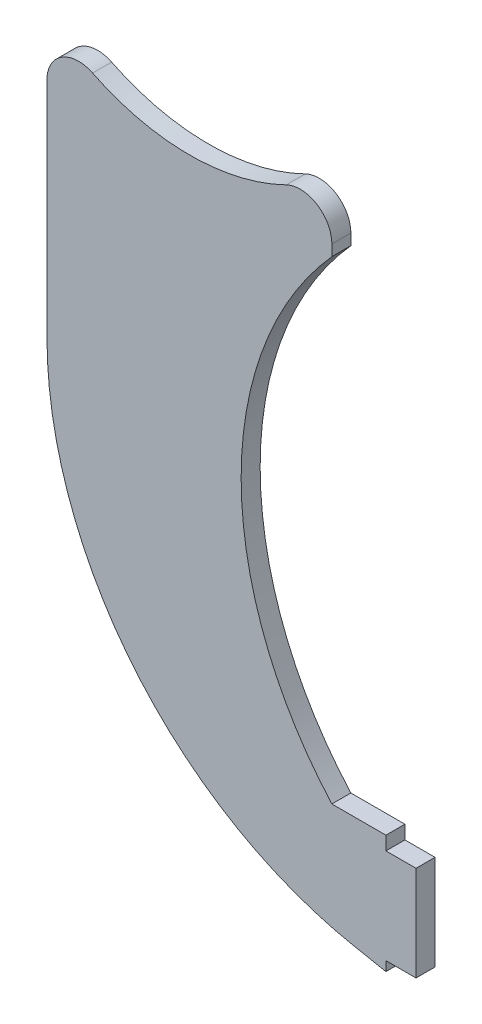
ISO-10303-21;
HEADER;
FILE_DESCRIPTION(('STEP AP214'),'2;1');
FILE_NAME('part.step','',(''),(''),'','','');
FILE_SCHEMA(('AUTOMOTIVE_DESIGN { 1 0 10303 214 1 1 1 1 }'));
ENDSEC;
DATA;
#1=APPLICATION_CONTEXT('core data for automotive mechanical design processes');
#2=APPLICATION_PROTOCOL_DEFINITION('international standard','automotive_design',2000,#1);
#3=PRODUCT_CONTEXT('',#1,'mechanical');
#4=PRODUCT('Part','Part','',(#3));
#5=PRODUCT_RELATED_PRODUCT_CATEGORY('part','',(#4));
#6=PRODUCT_DEFINITION_FORMATION('','',#4);
#7=PRODUCT_DEFINITION_CONTEXT('part definition',#1,'design');
#8=PRODUCT_DEFINITION('design','',#6,#7);
#9=PRODUCT_DEFINITION_SHAPE('','',#8);
#10=(LENGTH_UNIT() NAMED_UNIT(*) SI_UNIT(.MILLI.,.METRE.));
#11=(NAMED_UNIT(*) PLANE_ANGLE_UNIT() SI_UNIT($,.RADIAN.));
#12=(NAMED_UNIT(*) SI_UNIT($,.STERADIAN.) SOLID_ANGLE_UNIT());
#13=UNCERTAINTY_MEASURE_WITH_UNIT(LENGTH_MEASURE(1.E-05),#10,'distance_accuracy_value','');
#14=(GEOMETRIC_REPRESENTATION_CONTEXT(3) GLOBAL_UNCERTAINTY_ASSIGNED_CONTEXT((#13)) GLOBAL_UNIT_ASSIGNED_CONTEXT((#10,
#11,#12)) REPRESENTATION_CONTEXT('',''));
#15=CARTESIAN_POINT('',(0.,0.,0.));
#16=DIRECTION('',(0.,0.,1.));
#17=DIRECTION('',(1.,0.,0.));
#18=AXIS2_PLACEMENT_3D('',#15,#16,#17);
#19=CARTESIAN_POINT('',(-88.6231542313162,-194.789726065518,6.));
#20=DIRECTION('',(0.,1.,0.));
#21=DIRECTION('',(0.,0.,1.));
#22=AXIS2_PLACEMENT_3D('',#19,#20,#21);
#23=PLANE('',#22);
#24=DIRECTION('',(1.,0.,0.));
#25=VECTOR('',#24,1.);
#26=CARTESIAN_POINT('',(-88.6231542313162,-194.789726065518,0.));
#27=LINE('',#26,#25);
#28=CARTESIAN_POINT('',(-88.6231542313162,-194.789726065518,0.));
#29=VERTEX_POINT('',#28);
#30=CARTESIAN_POINT('',(-79.1231542313162,-194.789726065518,0.));
#31=VERTEX_POINT('',#30);
#32=EDGE_CURVE('E166',#29,#31,#27,.T.);
#33=ORIENTED_EDGE('',*,*,#32,.T.);
#34=DIRECTION('',(0.,0.,-1.));
#35=VECTOR('',#34,1.);
#36=CARTESIAN_POINT('',(-79.1231542313162,-194.789726065518,6.));
#37=LINE('',#36,#35);
#38=CARTESIAN_POINT('',(-79.1231542313162,-194.789726065518,6.));
#39=VERTEX_POINT('',#38);
#40=EDGE_CURVE('E145',#39,#31,#37,.T.);
#41=ORIENTED_EDGE('',*,*,#40,.F.);
#42=DIRECTION('',(1.,0.,0.));
#43=VECTOR('',#42,1.);
#44=CARTESIAN_POINT('',(-88.6231542313162,-194.789726065518,6.));
#45=LINE('',#44,#43);
#46=CARTESIAN_POINT('',(-88.6231542313162,-194.789726065518,6.));
#47=VERTEX_POINT('',#46);
#48=EDGE_CURVE('E153',#47,#39,#45,.T.);
#49=ORIENTED_EDGE('',*,*,#48,.F.);
#50=DIRECTION('',(0.,0.,-1.));
#51=VECTOR('',#50,1.);
#52=CARTESIAN_POINT('',(-88.6231542313162,-194.789726065518,6.));
#53=LINE('',#52,#51);
#54=EDGE_CURVE('E225',#47,#29,#53,.T.);
#55=ORIENTED_EDGE('',*,*,#54,.T.);
#56=EDGE_LOOP('',(#33,#41,#49,#55));
#57=FACE_BOUND('',#56,.T.);
#58=ADVANCED_FACE('F39',(#57),#23,.F.);
#59=CARTESIAN_POINT('',(-79.1231542313162,-194.789726065518,6.));
#60=DIRECTION('',(-1.,0.,0.));
#61=DIRECTION('',(0.,-1.,0.));
#62=AXIS2_PLACEMENT_3D('',#59,#60,#61);
#63=PLANE('',#62);
#64=DIRECTION('',(0.,1.,0.));
#65=VECTOR('',#64,1.);
#66=CARTESIAN_POINT('',(-79.1231542313162,-194.789726065518,0.));
#67=LINE('',#66,#65);
#68=CARTESIAN_POINT('',(-79.1231542313162,-164.789726065518,0.));
#69=VERTEX_POINT('',#68);
#70=EDGE_CURVE('E272',#31,#69,#67,.T.);
#71=ORIENTED_EDGE('',*,*,#70,.T.);
#72=DIRECTION('',(0.,0.,-1.));
#73=VECTOR('',#72,1.);
#74=CARTESIAN_POINT('',(-79.1231542313162,-164.789726065518,6.));
#75=LINE('',#74,#73);
#76=CARTESIAN_POINT('',(-79.1231542313162,-164.789726065518,6.));
#77=VERTEX_POINT('',#76);
#78=EDGE_CURVE('E148',#77,#69,#75,.T.);
#79=ORIENTED_EDGE('',*,*,#78,.F.);
#80=DIRECTION('',(0.,1.,0.));
#81=VECTOR('',#80,1.);
#82=CARTESIAN_POINT('',(-79.1231542313162,-194.789726065518,6.));
#83=LINE('',#82,#81);
#84=EDGE_CURVE('E141',#39,#77,#83,.T.);
#85=ORIENTED_EDGE('',*,*,#84,.F.);
#86=ORIENTED_EDGE('',*,*,#40,.T.);
#87=EDGE_LOOP('',(#71,#79,#85,#86));
#88=FACE_BOUND('',#87,.T.);
#89=ADVANCED_FACE('F143',(#88),#63,.F.);
#90=CARTESIAN_POINT('',(-79.1231542313162,-164.789726065518,6.));
#91=DIRECTION('',(0.,-1.,0.));
#92=DIRECTION('',(0.,0.,-1.));
#93=AXIS2_PLACEMENT_3D('',#90,#91,#92);
#94=PLANE('',#93);
#95=DIRECTION('',(-1.,0.,0.));
#96=VECTOR('',#95,1.);
#97=CARTESIAN_POINT('',(-79.1231542313162,-164.789726065518,0.));
#98=LINE('',#97,#96);
#99=CARTESIAN_POINT('',(-88.6231542313162,-164.789726065518,0.));
#100=VERTEX_POINT('',#99);
#101=EDGE_CURVE('E264',#69,#100,#98,.T.);
#102=ORIENTED_EDGE('',*,*,#101,.T.);
#103=DIRECTION('',(0.,0.,-1.));
#104=VECTOR('',#103,1.);
#105=CARTESIAN_POINT('',(-88.6231542313162,-164.789726065518,6.));
#106=LINE('',#105,#104);
#107=CARTESIAN_POINT('',(-88.6231542313162,-164.789726065518,6.));
#108=VERTEX_POINT('',#107);
#109=EDGE_CURVE('E175',#108,#100,#106,.T.);
#110=ORIENTED_EDGE('',*,*,#109,.F.);
#111=DIRECTION('',(-1.,0.,0.));
#112=VECTOR('',#111,1.);
#113=CARTESIAN_POINT('',(-79.1231542313162,-164.789726065518,6.));
#114=LINE('',#113,#112);
#115=EDGE_CURVE('E152',#77,#108,#114,.T.);
#116=ORIENTED_EDGE('',*,*,#115,.F.);
#117=ORIENTED_EDGE('',*,*,#78,.T.);
#118=EDGE_LOOP('',(#102,#110,#116,#117));
#119=FACE_BOUND('',#118,.T.);
#120=ADVANCED_FACE('F306',(#119),#94,.F.);
#121=CARTESIAN_POINT('',(-88.6231542313162,-164.789726065518,6.));
#122=DIRECTION('',(-1.,0.,0.));
#123=DIRECTION('',(0.,0.,1.));
#124=AXIS2_PLACEMENT_3D('',#121,#122,#123);
#125=PLANE('',#124);
#126=DIRECTION('',(0.,1.,0.));
#127=VECTOR('',#126,1.);
#128=CARTESIAN_POINT('',(-88.6231542313162,-164.789726065518,0.));
#129=LINE('',#128,#127);
#130=CARTESIAN_POINT('',(-88.6231542313162,-160.486992519924,0.));
#131=VERTEX_POINT('',#130);
#132=EDGE_CURVE('E259',#100,#131,#129,.T.);
#133=ORIENTED_EDGE('',*,*,#132,.T.);
#134=DIRECTION('',(0.,0.,-1.));
#135=VECTOR('',#134,1.);
#136=CARTESIAN_POINT('',(-88.6231542313162,-160.486992519924,6.));
#137=LINE('',#136,#135);
#138=CARTESIAN_POINT('',(-88.6231542313162,-160.486992519924,6.));
#139=VERTEX_POINT('',#138);
#140=EDGE_CURVE('E248',#139,#131,#137,.T.);
#141=ORIENTED_EDGE('',*,*,#140,.F.);
#142=DIRECTION('',(0.,1.,0.));
#143=VECTOR('',#142,1.);
#144=CARTESIAN_POINT('',(-88.6231542313162,-164.789726065518,6.));
#145=LINE('',#144,#143);
#146=EDGE_CURVE('E260',#108,#139,#145,.T.);
#147=ORIENTED_EDGE('',*,*,#146,.F.);
#148=ORIENTED_EDGE('',*,*,#109,.T.);
#149=EDGE_LOOP('',(#133,#141,#147,#148));
#150=FACE_BOUND('',#149,.T.);
#151=ADVANCED_FACE('F257',(#150),#125,.F.);
#152=CARTESIAN_POINT('',(-88.6231542313162,-160.486992519924,6.));
#153=DIRECTION('',(0.,-1.,0.));
#154=DIRECTION('',(0.,0.,-1.));
#155=AXIS2_PLACEMENT_3D('',#152,#153,#154);
#156=PLANE('',#155);
#157=DIRECTION('',(-1.,0.,0.));
#158=VECTOR('',#157,1.);
#159=CARTESIAN_POINT('',(-88.6231542313162,-160.486992519924,0.));
#160=LINE('',#159,#158);
#161=CARTESIAN_POINT('',(-105.686834951536,-160.486992519924,0.));
#162=VERTEX_POINT('',#161);
#163=EDGE_CURVE('E266',#131,#162,#160,.T.);
#164=ORIENTED_EDGE('',*,*,#163,.T.);
#165=DIRECTION('',(0.,0.,-1.));
#166=VECTOR('',#165,1.);
#167=CARTESIAN_POINT('',(-105.686834951536,-160.486992519924,6.));
#168=LINE('',#167,#166);
#169=CARTESIAN_POINT('',(-105.686834951536,-160.486992519924,6.));
#170=VERTEX_POINT('',#169);
#171=EDGE_CURVE('E244',#170,#162,#168,.T.);
#172=ORIENTED_EDGE('',*,*,#171,.F.);
#173=DIRECTION('',(-1.,0.,0.));
#174=VECTOR('',#173,1.);
#175=CARTESIAN_POINT('',(-88.6231542313162,-160.486992519924,6.));
#176=LINE('',#175,#174);
#177=EDGE_CURVE('E290',#139,#170,#176,.T.);
#178=ORIENTED_EDGE('',*,*,#177,.F.);
#179=ORIENTED_EDGE('',*,*,#140,.T.);
#180=EDGE_LOOP('',(#164,#172,#178,#179));
#181=FACE_BOUND('',#180,.T.);
#182=ADVANCED_FACE('F314',(#181),#156,.F.);
#183=CARTESIAN_POINT('',(-22.2755496894654,-85.6649121357012,6.));
#184=DIRECTION('',(0.,0.,-1.));
#185=DIRECTION('',(-1.,0.,0.));
#186=AXIS2_PLACEMENT_3D('',#183,#184,#185);
#187=CYLINDRICAL_SURFACE('',#186,112.052604709099);
#188=CARTESIAN_POINT('',(-22.2755496894654,-85.6649121357012,0.));
#189=DIRECTION('',(0.,0.,-1.));
#190=DIRECTION('',(-1.,0.,0.));
#191=AXIS2_PLACEMENT_3D('',#188,#189,#190);
#192=CIRCLE('',#191,112.052604709099);
#193=CARTESIAN_POINT('',(-105.686834951536,-10.8428317514789,0.));
#194=VERTEX_POINT('',#193);
#195=EDGE_CURVE('E214',#162,#194,#192,.T.);
#196=ORIENTED_EDGE('',*,*,#195,.T.);
#197=DIRECTION('',(0.,0.,-1.));
#198=VECTOR('',#197,1.);
#199=CARTESIAN_POINT('',(-105.686834951536,-10.8428317514789,6.));
#200=LINE('',#199,#198);
#201=CARTESIAN_POINT('',(-105.686834951536,-10.8428317514789,6.));
#202=VERTEX_POINT('',#201);
#203=EDGE_CURVE('E240',#202,#194,#200,.T.);
#204=ORIENTED_EDGE('',*,*,#203,.F.);
#205=CARTESIAN_POINT('',(-22.2755496894654,-85.6649121357012,6.));
#206=DIRECTION('',(0.,0.,-1.));
#207=DIRECTION('',(-1.,0.,0.));
#208=AXIS2_PLACEMENT_3D('',#205,#206,#207);
#209=CIRCLE('',#208,112.052604709099);
#210=EDGE_CURVE('E284',#170,#202,#209,.T.);
#211=ORIENTED_EDGE('',*,*,#210,.F.);
#212=ORIENTED_EDGE('',*,*,#171,.T.);
#213=EDGE_LOOP('',(#196,#204,#211,#212));
#214=FACE_BOUND('',#213,.T.);
#215=ADVANCED_FACE('F278',(#214),#187,.F.);
#216=CARTESIAN_POINT('',(-105.686834951536,-10.8428317514789,6.));
#217=DIRECTION('',(-1.,0.,0.));
#218=DIRECTION('',(0.,0.,1.));
#219=AXIS2_PLACEMENT_3D('',#216,#217,#218);
#220=PLANE('',#219);
#221=DIRECTION('',(0.,1.,0.));
#222=VECTOR('',#221,1.);
#223=CARTESIAN_POINT('',(-105.686834951536,-10.8428317514789,0.));
#224=LINE('',#223,#222);
#225=CARTESIAN_POINT('',(-105.686834951536,-7.38763159752667,0.));
#226=VERTEX_POINT('',#225);
#227=EDGE_CURVE('E208',#194,#226,#224,.T.);
#228=ORIENTED_EDGE('',*,*,#227,.T.);
#229=DIRECTION('',(0.,0.,-1.));
#230=VECTOR('',#229,1.);
#231=CARTESIAN_POINT('',(-105.686834951536,-7.38763159752667,6.));
#232=LINE('',#231,#230);
#233=CARTESIAN_POINT('',(-105.686834951536,-7.38763159752667,6.));
#234=VERTEX_POINT('',#233);
#235=EDGE_CURVE('E48',#226,#234,#232,.F.);
#236=ORIENTED_EDGE('',*,*,#235,.T.);
#237=DIRECTION('',(0.,1.,0.));
#238=VECTOR('',#237,1.);
#239=CARTESIAN_POINT('',(-105.686834951536,-10.8428317514789,6.));
#240=LINE('',#239,#238);
#241=EDGE_CURVE('E282',#202,#234,#240,.T.);
#242=ORIENTED_EDGE('',*,*,#241,.F.);
#243=ORIENTED_EDGE('',*,*,#203,.T.);
#244=EDGE_LOOP('',(#228,#236,#242,#243));
#245=FACE_BOUND('',#244,.T.);
#246=ADVANCED_FACE('F281',(#245),#220,.F.);
#247=CARTESIAN_POINT('',(-150.657550595257,63.8132919104593,6.));
#248=DIRECTION('',(0.,0.,-1.));
#249=DIRECTION('',(-1.,0.,0.));
#250=AXIS2_PLACEMENT_3D('',#247,#248,#249);
#251=CYLINDRICAL_SURFACE('',#250,69.3254212785789);
#252=CARTESIAN_POINT('',(-150.657550595257,63.8132919104593,6.));
#253=DIRECTION('',(0.,0.,-1.));
#254=DIRECTION('',(1.,0.,0.));
#255=AXIS2_PLACEMENT_3D('',#252,#253,#254);
#256=CIRCLE('',#255,69.3254212785789);
#257=CARTESIAN_POINT('',(-120.095348020872,1.58816989969313,6.));
#258=VERTEX_POINT('',#257);
#259=CARTESIAN_POINT('',(-181.219753169641,1.58816989969311,6.));
#260=VERTEX_POINT('',#259);
#261=EDGE_CURVE('E200',#258,#260,#256,.T.);
#262=ORIENTED_EDGE('',*,*,#261,.F.);
#263=DIRECTION('',(0.,0.,-1.));
#264=VECTOR('',#263,1.);
#265=CARTESIAN_POINT('',(-120.095348020872,1.58816989969313,6.));
#266=LINE('',#265,#264);
#267=CARTESIAN_POINT('',(-120.095348020872,1.58816989969313,0.));
#268=VERTEX_POINT('',#267);
#269=EDGE_CURVE('E189',#258,#268,#266,.T.);
#270=ORIENTED_EDGE('',*,*,#269,.T.);
#271=CARTESIAN_POINT('',(-150.657550595257,63.8132919104593,0.));
#272=DIRECTION('',(0.,0.,-1.));
#273=DIRECTION('',(1.,0.,0.));
#274=AXIS2_PLACEMENT_3D('',#271,#272,#273);
#275=CIRCLE('',#274,69.3254212785789);
#276=CARTESIAN_POINT('',(-181.219753169641,1.58816989969311,0.));
#277=VERTEX_POINT('',#276);
#278=EDGE_CURVE('E199',#268,#277,#275,.T.);
#279=ORIENTED_EDGE('',*,*,#278,.T.);
#280=DIRECTION('',(0.,0.,-1.));
#281=VECTOR('',#280,1.);
#282=CARTESIAN_POINT('',(-181.219753169641,1.58816989969309,6.));
#283=LINE('',#282,#281);
#284=EDGE_CURVE('E182',#277,#260,#283,.F.);
#285=ORIENTED_EDGE('',*,*,#284,.T.);
#286=EDGE_LOOP('',(#262,#270,#279,#285));
#287=FACE_BOUND('',#286,.T.);
#288=ADVANCED_FACE('F198',(#287),#251,.F.);
#289=CARTESIAN_POINT('',(-195.628266238977,11.0529965175781,6.));
#290=DIRECTION('',(1.,0.,0.));
#291=DIRECTION('',(0.,0.,-1.));
#292=AXIS2_PLACEMENT_3D('',#289,#290,#291);
#293=PLANE('',#292);
#294=DIRECTION('',(0.,-1.,0.));
#295=VECTOR('',#294,1.);
#296=CARTESIAN_POINT('',(-195.628266238977,11.0529965175781,6.));
#297=LINE('',#296,#295);
#298=CARTESIAN_POINT('',(-195.628266238977,-7.38763159752669,6.));
#299=VERTEX_POINT('',#298);
#300=CARTESIAN_POINT('',(-195.628266238977,-78.0760286910832,6.));
#301=VERTEX_POINT('',#300);
#302=EDGE_CURVE('E288',#299,#301,#297,.T.);
#303=ORIENTED_EDGE('',*,*,#302,.F.);
#304=DIRECTION('',(0.,0.,-1.));
#305=VECTOR('',#304,1.);
#306=CARTESIAN_POINT('',(-195.628266238977,-7.38763159752669,6.));
#307=LINE('',#306,#305);
#308=CARTESIAN_POINT('',(-195.628266238977,-7.38763159752669,0.));
#309=VERTEX_POINT('',#308);
#310=EDGE_CURVE('E168',#299,#309,#307,.T.);
#311=ORIENTED_EDGE('',*,*,#310,.T.);
#312=DIRECTION('',(0.,-1.,0.));
#313=VECTOR('',#312,1.);
#314=CARTESIAN_POINT('',(-195.628266238977,11.0529965175781,0.));
#315=LINE('',#314,#313);
#316=CARTESIAN_POINT('',(-195.628266238977,-78.0760286910832,0.));
#317=VERTEX_POINT('',#316);
#318=EDGE_CURVE('E207',#309,#317,#315,.T.);
#319=ORIENTED_EDGE('',*,*,#318,.T.);
#320=DIRECTION('',(0.,0.,-1.));
#321=VECTOR('',#320,1.);
#322=CARTESIAN_POINT('',(-195.628266238977,-78.0760286910832,6.));
#323=LINE('',#322,#321);
#324=EDGE_CURVE('E236',#301,#317,#323,.T.);
#325=ORIENTED_EDGE('',*,*,#324,.F.);
#326=EDGE_LOOP('',(#303,#311,#319,#325));
#327=FACE_BOUND('',#326,.T.);
#328=ADVANCED_FACE('F343',(#327),#293,.F.);
#329=CARTESIAN_POINT('',(-75.628266238977,-78.0760286910838,6.));
#330=DIRECTION('',(0.,0.,-1.));
#331=DIRECTION('',(-1.,0.,0.));
#332=AXIS2_PLACEMENT_3D('',#329,#330,#331);
#333=CYLINDRICAL_SURFACE('',#332,120.);
#334=CARTESIAN_POINT('',(-75.628266238977,-78.0760286910838,0.));
#335=DIRECTION('',(0.,0.,1.));
#336=DIRECTION('',(1.,0.,0.));
#337=AXIS2_PLACEMENT_3D('',#334,#335,#336);
#338=CIRCLE('',#337,120.);
#339=CARTESIAN_POINT('',(-98.4522087797356,-195.885483519192,0.));
#340=VERTEX_POINT('',#339);
#341=EDGE_CURVE('E212',#317,#340,#338,.T.);
#342=ORIENTED_EDGE('',*,*,#341,.T.);
#343=DIRECTION('',(0.,0.,-1.));
#344=VECTOR('',#343,1.);
#345=CARTESIAN_POINT('',(-98.4522087797356,-195.885483519192,6.));
#346=LINE('',#345,#344);
#347=CARTESIAN_POINT('',(-98.4522087797356,-195.885483519192,6.));
#348=VERTEX_POINT('',#347);
#349=EDGE_CURVE('E232',#348,#340,#346,.T.);
#350=ORIENTED_EDGE('',*,*,#349,.F.);
#351=CARTESIAN_POINT('',(-75.628266238977,-78.0760286910838,6.));
#352=DIRECTION('',(0.,0.,1.));
#353=DIRECTION('',(1.,0.,0.));
#354=AXIS2_PLACEMENT_3D('',#351,#352,#353);
#355=CIRCLE('',#354,120.);
#356=EDGE_CURVE('E296',#301,#348,#355,.T.);
#357=ORIENTED_EDGE('',*,*,#356,.F.);
#358=ORIENTED_EDGE('',*,*,#324,.T.);
#359=EDGE_LOOP('',(#342,#350,#357,#358));
#360=FACE_BOUND('',#359,.T.);
#361=ADVANCED_FACE('F348',(#360),#333,.T.);
#362=CARTESIAN_POINT('',(-98.4522087797355,-195.885483519192,6.));
#363=DIRECTION('',(0.190199521172994,0.981745456900903,0.));
#364=DIRECTION('',(-0.981745456900904,0.190199521172994,0.));
#365=AXIS2_PLACEMENT_3D('',#362,#363,#364);
#366=PLANE('',#365);
#367=DIRECTION('',(0.981745456900904,-0.190199521172994,0.));
#368=VECTOR('',#367,1.);
#369=CARTESIAN_POINT('',(-98.4522087797355,-195.885483519192,0.));
#370=LINE('',#369,#368);
#371=CARTESIAN_POINT('',(-88.6231542313162,-197.789726065518,0.));
#372=VERTEX_POINT('',#371);
#373=EDGE_CURVE('E220',#340,#372,#370,.T.);
#374=ORIENTED_EDGE('',*,*,#373,.T.);
#375=DIRECTION('',(0.,0.,-1.));
#376=VECTOR('',#375,1.);
#377=CARTESIAN_POINT('',(-88.6231542313162,-197.789726065518,6.));
#378=LINE('',#377,#376);
#379=CARTESIAN_POINT('',(-88.6231542313162,-197.789726065518,6.));
#380=VERTEX_POINT('',#379);
#381=EDGE_CURVE('E228',#380,#372,#378,.T.);
#382=ORIENTED_EDGE('',*,*,#381,.F.);
#383=DIRECTION('',(0.981745456900904,-0.190199521172994,0.));
#384=VECTOR('',#383,1.);
#385=CARTESIAN_POINT('',(-98.4522087797355,-195.885483519192,6.));
#386=LINE('',#385,#384);
#387=EDGE_CURVE('E299',#348,#380,#386,.T.);
#388=ORIENTED_EDGE('',*,*,#387,.F.);
#389=ORIENTED_EDGE('',*,*,#349,.T.);
#390=EDGE_LOOP('',(#374,#382,#388,#389));
#391=FACE_BOUND('',#390,.T.);
#392=ADVANCED_FACE('F352',(#391),#366,.F.);
#393=CARTESIAN_POINT('',(-88.6231542313162,-197.789726065518,6.));
#394=DIRECTION('',(-1.,0.,0.));
#395=DIRECTION('',(0.,0.,1.));
#396=AXIS2_PLACEMENT_3D('',#393,#394,#395);
#397=PLANE('',#396);
#398=DIRECTION('',(0.,1.,0.));
#399=VECTOR('',#398,1.);
#400=CARTESIAN_POINT('',(-88.6231542313162,-197.789726065518,0.));
#401=LINE('',#400,#399);
#402=EDGE_CURVE('E163',#372,#29,#401,.T.);
#403=ORIENTED_EDGE('',*,*,#402,.T.);
#404=ORIENTED_EDGE('',*,*,#54,.F.);
#405=DIRECTION('',(0.,1.,0.));
#406=VECTOR('',#405,1.);
#407=CARTESIAN_POINT('',(-88.6231542313162,-197.789726065518,6.));
#408=LINE('',#407,#406);
#409=EDGE_CURVE('E158',#380,#47,#408,.T.);
#410=ORIENTED_EDGE('',*,*,#409,.F.);
#411=ORIENTED_EDGE('',*,*,#381,.T.);
#412=EDGE_LOOP('',(#403,#404,#410,#411));
#413=FACE_BOUND('',#412,.T.);
#414=ADVANCED_FACE('F356',(#413),#397,.F.);
#415=CARTESIAN_POINT('',(-22.2755496894654,-85.6649121357012,6.));
#416=DIRECTION('',(0.,0.,-1.));
#417=DIRECTION('',(-1.,0.,0.));
#418=AXIS2_PLACEMENT_3D('',#415,#416,#417);
#419=PLANE('',#418);
#420=ORIENTED_EDGE('',*,*,#241,.T.);
#421=CARTESIAN_POINT('',(-115.686834951536,-7.38763159752667,6.));
#422=DIRECTION('',(0.,0.,-1.));
#423=DIRECTION('',(-1.,0.,0.));
#424=AXIS2_PLACEMENT_3D('',#421,#422,#423);
#425=CIRCLE('',#424,10.);
#426=EDGE_CURVE('E11',#234,#258,#425,.F.);
#427=ORIENTED_EDGE('',*,*,#426,.T.);
#428=ORIENTED_EDGE('',*,*,#261,.T.);
#429=CARTESIAN_POINT('',(-185.628266238977,-7.38763159752669,6.));
#430=DIRECTION('',(0.,0.,-1.));
#431=DIRECTION('',(-1.,0.,0.));
#432=AXIS2_PLACEMENT_3D('',#429,#430,#431);
#433=CIRCLE('',#432,10.);
#434=EDGE_CURVE('E186',#260,#299,#433,.F.);
#435=ORIENTED_EDGE('',*,*,#434,.T.);
#436=ORIENTED_EDGE('',*,*,#302,.T.);
#437=ORIENTED_EDGE('',*,*,#356,.T.);
#438=ORIENTED_EDGE('',*,*,#387,.T.);
#439=ORIENTED_EDGE('',*,*,#409,.T.);
#440=ORIENTED_EDGE('',*,*,#48,.T.);
#441=ORIENTED_EDGE('',*,*,#84,.T.);
#442=ORIENTED_EDGE('',*,*,#115,.T.);
#443=ORIENTED_EDGE('',*,*,#146,.T.);
#444=ORIENTED_EDGE('',*,*,#177,.T.);
#445=ORIENTED_EDGE('',*,*,#210,.T.);
#446=EDGE_LOOP('',(#420,#427,#428,#435,#436,#437,#438,#439,#440,#441,#442,#443,#444,#445));
#447=FACE_BOUND('',#446,.T.);
#448=ADVANCED_FACE('F156',(#447),#419,.F.);
#449=CARTESIAN_POINT('',(-22.2755496894654,-85.6649121357012,0.));
#450=DIRECTION('',(0.,0.,-1.));
#451=DIRECTION('',(-1.,0.,0.));
#452=AXIS2_PLACEMENT_3D('',#449,#450,#451);
#453=PLANE('',#452);
#454=ORIENTED_EDGE('',*,*,#278,.F.);
#455=CARTESIAN_POINT('',(-115.686834951536,-7.38763159752667,0.));
#456=DIRECTION('',(0.,0.,-1.));
#457=DIRECTION('',(-1.,0.,0.));
#458=AXIS2_PLACEMENT_3D('',#455,#456,#457);
#459=CIRCLE('',#458,10.);
#460=EDGE_CURVE('E62',#268,#226,#459,.T.);
#461=ORIENTED_EDGE('',*,*,#460,.T.);
#462=ORIENTED_EDGE('',*,*,#227,.F.);
#463=ORIENTED_EDGE('',*,*,#195,.F.);
#464=ORIENTED_EDGE('',*,*,#163,.F.);
#465=ORIENTED_EDGE('',*,*,#132,.F.);
#466=ORIENTED_EDGE('',*,*,#101,.F.);
#467=ORIENTED_EDGE('',*,*,#70,.F.);
#468=ORIENTED_EDGE('',*,*,#32,.F.);
#469=ORIENTED_EDGE('',*,*,#402,.F.);
#470=ORIENTED_EDGE('',*,*,#373,.F.);
#471=ORIENTED_EDGE('',*,*,#341,.F.);
#472=ORIENTED_EDGE('',*,*,#318,.F.);
#473=CARTESIAN_POINT('',(-185.628266238977,-7.38763159752669,0.));
#474=DIRECTION('',(0.,0.,-1.));
#475=DIRECTION('',(-1.,0.,0.));
#476=AXIS2_PLACEMENT_3D('',#473,#474,#475);
#477=CIRCLE('',#476,10.);
#478=EDGE_CURVE('E173',#309,#277,#477,.T.);
#479=ORIENTED_EDGE('',*,*,#478,.T.);
#480=EDGE_LOOP('',(#454,#461,#462,#463,#464,#465,#466,#467,#468,#469,#470,#471,#472,#479));
#481=FACE_BOUND('',#480,.T.);
#482=ADVANCED_FACE('F203',(#481),#453,.T.);
#483=CARTESIAN_POINT('',(-185.628266238977,-7.38763159752669,6.));
#484=DIRECTION('',(0.,0.,-1.));
#485=DIRECTION('',(-1.,0.,0.));
#486=AXIS2_PLACEMENT_3D('',#483,#484,#485);
#487=CYLINDRICAL_SURFACE('',#486,10.);
#488=ORIENTED_EDGE('',*,*,#434,.F.);
#489=ORIENTED_EDGE('',*,*,#284,.F.);
#490=ORIENTED_EDGE('',*,*,#478,.F.);
#491=ORIENTED_EDGE('',*,*,#310,.F.);
#492=EDGE_LOOP('',(#488,#489,#490,#491));
#493=FACE_BOUND('',#492,.T.);
#494=ADVANCED_FACE('F330',(#493),#487,.T.);
#495=CARTESIAN_POINT('',(-115.686834951536,-7.38763159752667,6.));
#496=DIRECTION('',(0.,0.,-1.));
#497=DIRECTION('',(-1.,0.,0.));
#498=AXIS2_PLACEMENT_3D('',#495,#496,#497);
#499=CYLINDRICAL_SURFACE('',#498,10.);
#500=ORIENTED_EDGE('',*,*,#426,.F.);
#501=ORIENTED_EDGE('',*,*,#235,.F.);
#502=ORIENTED_EDGE('',*,*,#460,.F.);
#503=ORIENTED_EDGE('',*,*,#269,.F.);
#504=EDGE_LOOP('',(#500,#501,#502,#503));
#505=FACE_BOUND('',#504,.T.);
#506=ADVANCED_FACE('F41',(#505),#499,.T.);
#507=CLOSED_SHELL('',(#58,#89,#120,#151,#182,#215,#246,#288,#328,#361,#392,#414,#448,#482,#494,#506));
#508=MANIFOLD_SOLID_BREP('B2',#507);
#509=ADVANCED_BREP_SHAPE_REPRESENTATION('',(#18,#508),#14);
#510=SHAPE_DEFINITION_REPRESENTATION(#9,#509);
ENDSEC;
END-ISO-10303-21;
